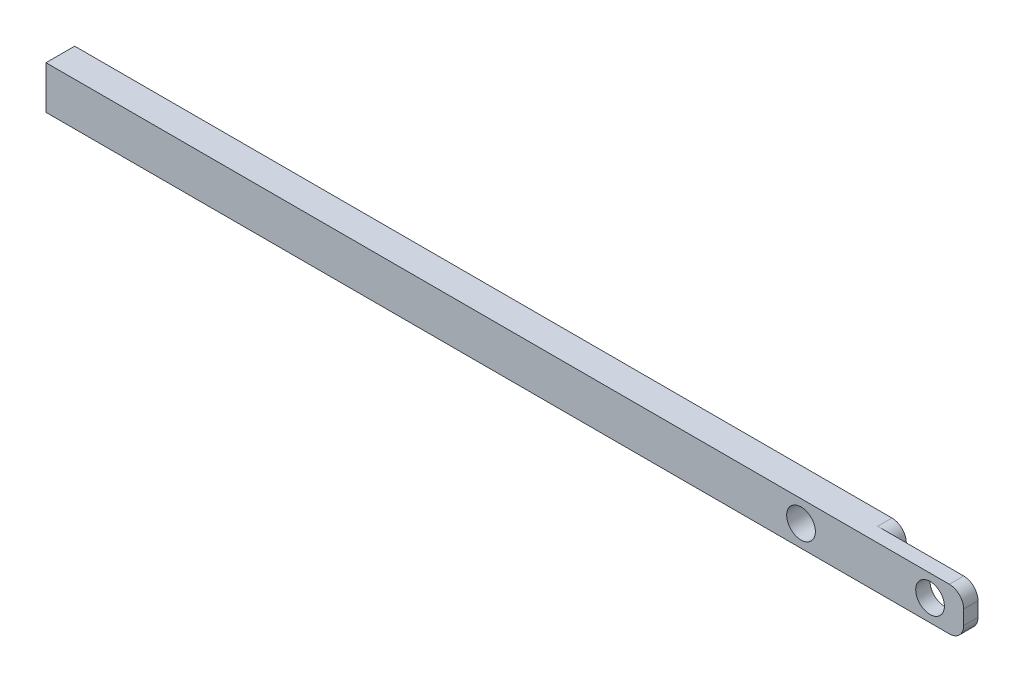
ISO-10303-21;
HEADER;
FILE_DESCRIPTION(('STEP AP214'),'2;1');
FILE_NAME('part.step','',(''),(''),'','','');
FILE_SCHEMA(('AUTOMOTIVE_DESIGN { 1 0 10303 214 1 1 1 1 }'));
ENDSEC;
DATA;
#1=APPLICATION_CONTEXT('core data for automotive mechanical design processes');
#2=APPLICATION_PROTOCOL_DEFINITION('international standard','automotive_design',2000,#1);
#3=PRODUCT_CONTEXT('',#1,'mechanical');
#4=PRODUCT('Part','Part','',(#3));
#5=PRODUCT_RELATED_PRODUCT_CATEGORY('part','',(#4));
#6=PRODUCT_DEFINITION_FORMATION('','',#4);
#7=PRODUCT_DEFINITION_CONTEXT('part definition',#1,'design');
#8=PRODUCT_DEFINITION('design','',#6,#7);
#9=PRODUCT_DEFINITION_SHAPE('','',#8);
#10=(LENGTH_UNIT() NAMED_UNIT(*) SI_UNIT(.MILLI.,.METRE.));
#11=(NAMED_UNIT(*) PLANE_ANGLE_UNIT() SI_UNIT($,.RADIAN.));
#12=(NAMED_UNIT(*) SI_UNIT($,.STERADIAN.) SOLID_ANGLE_UNIT());
#13=UNCERTAINTY_MEASURE_WITH_UNIT(LENGTH_MEASURE(1.E-05),#10,'distance_accuracy_value','');
#14=(GEOMETRIC_REPRESENTATION_CONTEXT(3) GLOBAL_UNCERTAINTY_ASSIGNED_CONTEXT((#13)) GLOBAL_UNIT_ASSIGNED_CONTEXT((#10,
#11,#12)) REPRESENTATION_CONTEXT('',''));
#15=CARTESIAN_POINT('',(0.,0.,0.));
#16=DIRECTION('',(0.,0.,1.));
#17=DIRECTION('',(1.,0.,0.));
#18=AXIS2_PLACEMENT_3D('',#15,#16,#17);
#19=CARTESIAN_POINT('',(-637.611940298508,30.,-61.7910447761194));
#20=DIRECTION('',(1.,0.,0.));
#21=DIRECTION('',(0.,0.,-1.));
#22=AXIS2_PLACEMENT_3D('',#19,#20,#21);
#23=PLANE('',#22);
#24=DIRECTION('',(0.,0.,1.));
#25=VECTOR('',#24,1.);
#26=CARTESIAN_POINT('',(-637.611940298508,0.,-61.7910447761194));
#27=LINE('',#26,#25);
#28=CARTESIAN_POINT('',(-637.611940298508,0.,-61.7910447761194));
#29=VERTEX_POINT('',#28);
#30=CARTESIAN_POINT('',(-637.611940298508,0.,-41.7910447761194));
#31=VERTEX_POINT('',#30);
#32=EDGE_CURVE('E141',#29,#31,#27,.T.);
#33=ORIENTED_EDGE('',*,*,#32,.T.);
#34=DIRECTION('',(0.,-1.,0.));
#35=VECTOR('',#34,1.);
#36=CARTESIAN_POINT('',(-637.611940298508,30.,-41.7910447761194));
#37=LINE('',#36,#35);
#38=CARTESIAN_POINT('',(-637.611940298508,30.,-41.7910447761194));
#39=VERTEX_POINT('',#38);
#40=EDGE_CURVE('E120',#39,#31,#37,.T.);
#41=ORIENTED_EDGE('',*,*,#40,.F.);
#42=DIRECTION('',(0.,0.,1.));
#43=VECTOR('',#42,1.);
#44=CARTESIAN_POINT('',(-637.611940298508,30.,-61.7910447761194));
#45=LINE('',#44,#43);
#46=CARTESIAN_POINT('',(-637.611940298508,30.,-61.7910447761194));
#47=VERTEX_POINT('',#46);
#48=EDGE_CURVE('E128',#47,#39,#45,.T.);
#49=ORIENTED_EDGE('',*,*,#48,.F.);
#50=DIRECTION('',(0.,-1.,0.));
#51=VECTOR('',#50,1.);
#52=CARTESIAN_POINT('',(-637.611940298508,30.,-61.7910447761194));
#53=LINE('',#52,#51);
#54=EDGE_CURVE('E207',#47,#29,#53,.T.);
#55=ORIENTED_EDGE('',*,*,#54,.T.);
#56=EDGE_LOOP('',(#33,#41,#49,#55));
#57=FACE_BOUND('',#56,.T.);
#58=ADVANCED_FACE('F37',(#57),#23,.F.);
#59=CARTESIAN_POINT('',(-17.6119402985075,30.,-41.7910447761194));
#60=DIRECTION('',(0.,0.,-1.));
#61=DIRECTION('',(-1.,0.,0.));
#62=AXIS2_PLACEMENT_3D('',#59,#60,#61);
#63=PLANE('',#62);
#64=CARTESIAN_POINT('',(-21.0463603591865,15.,-41.7910447761194));
#65=DIRECTION('',(0.,0.,1.));
#66=DIRECTION('',(1.,0.,0.));
#67=AXIS2_PLACEMENT_3D('',#64,#65,#66);
#68=CIRCLE('',#67,10.);
#69=CARTESIAN_POINT('',(-11.0463603591865,15.,-41.7910447761194));
#70=VERTEX_POINT('',#69);
#71=EDGE_CURVE('E367',#70,#70,#68,.T.);
#72=ORIENTED_EDGE('',*,*,#71,.F.);
#73=EDGE_LOOP('',(#72));
#74=FACE_BOUND('',#73,.T.);
#75=CARTESIAN_POINT('',(-111.046360359186,15.,-41.7910447761194));
#76=DIRECTION('',(0.,0.,1.));
#77=DIRECTION('',(1.,0.,0.));
#78=AXIS2_PLACEMENT_3D('',#75,#76,#77);
#79=CIRCLE('',#78,10.);
#80=CARTESIAN_POINT('',(-101.046360359186,15.,-41.7910447761194));
#81=VERTEX_POINT('',#80);
#82=EDGE_CURVE('E370',#81,#81,#79,.T.);
#83=ORIENTED_EDGE('',*,*,#82,.F.);
#84=EDGE_LOOP('',(#83));
#85=FACE_BOUND('',#84,.T.);
#86=DIRECTION('',(1.,0.,0.));
#87=VECTOR('',#86,1.);
#88=CARTESIAN_POINT('',(-17.6119402985075,0.,-41.7910447761194));
#89=LINE('',#88,#87);
#90=CARTESIAN_POINT('',(-7.61194029850754,0.,-41.7910447761194));
#91=VERTEX_POINT('',#90);
#92=EDGE_CURVE('E203',#31,#91,#89,.T.);
#93=ORIENTED_EDGE('',*,*,#92,.T.);
#94=CARTESIAN_POINT('',(-7.61194029850754,10.,-41.7910447761194));
#95=DIRECTION('',(0.,0.,-1.));
#96=DIRECTION('',(-1.,0.,0.));
#97=AXIS2_PLACEMENT_3D('',#94,#95,#96);
#98=CIRCLE('',#97,10.);
#99=CARTESIAN_POINT('',(2.38805970149246,10.,-41.7910447761194));
#100=VERTEX_POINT('',#99);
#101=EDGE_CURVE('E53',#91,#100,#98,.F.);
#102=ORIENTED_EDGE('',*,*,#101,.T.);
#103=DIRECTION('',(0.,-1.,0.));
#104=VECTOR('',#103,1.);
#105=CARTESIAN_POINT('',(2.38805970149246,30.,-41.7910447761194));
#106=LINE('',#105,#104);
#107=CARTESIAN_POINT('',(2.38805970149246,20.,-41.7910447761194));
#108=VERTEX_POINT('',#107);
#109=EDGE_CURVE('E143',#108,#100,#106,.T.);
#110=ORIENTED_EDGE('',*,*,#109,.F.);
#111=CARTESIAN_POINT('',(-7.61194029850754,20.,-41.7910447761194));
#112=DIRECTION('',(0.,0.,-1.));
#113=DIRECTION('',(-1.,0.,0.));
#114=AXIS2_PLACEMENT_3D('',#111,#112,#113);
#115=CIRCLE('',#114,10.);
#116=CARTESIAN_POINT('',(-7.61194029850754,30.,-41.7910447761194));
#117=VERTEX_POINT('',#116);
#118=EDGE_CURVE('E123',#108,#117,#115,.F.);
#119=ORIENTED_EDGE('',*,*,#118,.T.);
#120=DIRECTION('',(1.,0.,0.));
#121=VECTOR('',#120,1.);
#122=CARTESIAN_POINT('',(-637.611940298508,30.,-41.7910447761194));
#123=LINE('',#122,#121);
#124=EDGE_CURVE('E116',#39,#117,#123,.T.);
#125=ORIENTED_EDGE('',*,*,#124,.F.);
#126=ORIENTED_EDGE('',*,*,#40,.T.);
#127=EDGE_LOOP('',(#93,#102,#110,#119,#125,#126));
#128=FACE_BOUND('',#127,.T.);
#129=ADVANCED_FACE('F118',(#74,#85,#128),#63,.F.);
#130=CARTESIAN_POINT('',(2.38805970149246,30.,-41.7910447761194));
#131=DIRECTION('',(-1.,0.,0.));
#132=DIRECTION('',(0.,0.,1.));
#133=AXIS2_PLACEMENT_3D('',#130,#131,#132);
#134=PLANE('',#133);
#135=ORIENTED_EDGE('',*,*,#109,.T.);
#136=DIRECTION('',(0.,0.,-1.));
#137=VECTOR('',#136,1.);
#138=CARTESIAN_POINT('',(2.38805970149246,10.,-41.7910447761194));
#139=LINE('',#138,#137);
#140=CARTESIAN_POINT('',(2.38805970149246,10.,-51.7910447761194));
#141=VERTEX_POINT('',#140);
#142=EDGE_CURVE('E167',#100,#141,#139,.T.);
#143=ORIENTED_EDGE('',*,*,#142,.T.);
#144=DIRECTION('',(0.,-1.,0.));
#145=VECTOR('',#144,1.);
#146=CARTESIAN_POINT('',(2.38805970149246,30.,-51.7910447761194));
#147=LINE('',#146,#145);
#148=CARTESIAN_POINT('',(2.38805970149246,20.,-51.7910447761194));
#149=VERTEX_POINT('',#148);
#150=EDGE_CURVE('E147',#149,#141,#147,.T.);
#151=ORIENTED_EDGE('',*,*,#150,.F.);
#152=DIRECTION('',(0.,0.,-1.));
#153=VECTOR('',#152,1.);
#154=CARTESIAN_POINT('',(2.38805970149246,20.,-41.7910447761194));
#155=LINE('',#154,#153);
#156=EDGE_CURVE('E60',#149,#108,#155,.F.);
#157=ORIENTED_EDGE('',*,*,#156,.T.);
#158=EDGE_LOOP('',(#135,#143,#151,#157));
#159=FACE_BOUND('',#158,.T.);
#160=ADVANCED_FACE('F210',(#159),#134,.F.);
#161=CARTESIAN_POINT('',(-57.6119402985076,30.,-51.7910447761194));
#162=DIRECTION('',(0.,0.,1.));
#163=DIRECTION('',(1.,0.,0.));
#164=AXIS2_PLACEMENT_3D('',#161,#162,#163);
#165=PLANE('',#164);
#166=CARTESIAN_POINT('',(-21.0463603591865,15.,-51.7910447761194));
#167=DIRECTION('',(0.,0.,1.));
#168=DIRECTION('',(1.,0.,0.));
#169=AXIS2_PLACEMENT_3D('',#166,#167,#168);
#170=CIRCLE('',#169,10.);
#171=CARTESIAN_POINT('',(-11.0463603591865,15.,-51.7910447761194));
#172=VERTEX_POINT('',#171);
#173=EDGE_CURVE('E41',#172,#172,#170,.T.);
#174=ORIENTED_EDGE('',*,*,#173,.T.);
#175=EDGE_LOOP('',(#174));
#176=FACE_BOUND('',#175,.T.);
#177=ORIENTED_EDGE('',*,*,#150,.T.);
#178=CARTESIAN_POINT('',(-7.61194029850754,10.,-51.7910447761194));
#179=DIRECTION('',(0.,0.,1.));
#180=DIRECTION('',(1.,0.,0.));
#181=AXIS2_PLACEMENT_3D('',#178,#179,#180);
#182=CIRCLE('',#181,10.);
#183=CARTESIAN_POINT('',(-7.61194029850754,0.,-51.7910447761194));
#184=VERTEX_POINT('',#183);
#185=EDGE_CURVE('E172',#141,#184,#182,.F.);
#186=ORIENTED_EDGE('',*,*,#185,.T.);
#187=DIRECTION('',(-1.,0.,0.));
#188=VECTOR('',#187,1.);
#189=CARTESIAN_POINT('',(-57.6119402985076,0.,-51.7910447761194));
#190=LINE('',#189,#188);
#191=CARTESIAN_POINT('',(-67.6119402985076,0.,-51.7910447761194));
#192=VERTEX_POINT('',#191);
#193=EDGE_CURVE('E185',#184,#192,#190,.T.);
#194=ORIENTED_EDGE('',*,*,#193,.T.);
#195=CARTESIAN_POINT('',(-67.6119402985076,10.,-51.7910447761194));
#196=DIRECTION('',(0.,0.,1.));
#197=DIRECTION('',(1.,0.,0.));
#198=AXIS2_PLACEMENT_3D('',#195,#196,#197);
#199=CIRCLE('',#198,10.);
#200=CARTESIAN_POINT('',(-57.6119402985076,10.,-51.7910447761194));
#201=VERTEX_POINT('',#200);
#202=EDGE_CURVE('E46',#192,#201,#199,.T.);
#203=ORIENTED_EDGE('',*,*,#202,.T.);
#204=DIRECTION('',(0.,-1.,0.));
#205=VECTOR('',#204,1.);
#206=CARTESIAN_POINT('',(-57.6119402985076,30.,-51.7910447761194));
#207=LINE('',#206,#205);
#208=CARTESIAN_POINT('',(-57.6119402985076,20.,-51.7910447761194));
#209=VERTEX_POINT('',#208);
#210=EDGE_CURVE('E182',#209,#201,#207,.T.);
#211=ORIENTED_EDGE('',*,*,#210,.F.);
#212=CARTESIAN_POINT('',(-67.6119402985076,20.,-51.7910447761194));
#213=DIRECTION('',(0.,0.,1.));
#214=DIRECTION('',(1.,0.,0.));
#215=AXIS2_PLACEMENT_3D('',#212,#213,#214);
#216=CIRCLE('',#215,10.);
#217=CARTESIAN_POINT('',(-67.6119402985076,30.,-51.7910447761194));
#218=VERTEX_POINT('',#217);
#219=EDGE_CURVE('E11',#209,#218,#216,.T.);
#220=ORIENTED_EDGE('',*,*,#219,.T.);
#221=DIRECTION('',(-1.,0.,0.));
#222=VECTOR('',#221,1.);
#223=CARTESIAN_POINT('',(-57.6119402985076,30.,-51.7910447761194));
#224=LINE('',#223,#222);
#225=CARTESIAN_POINT('',(-7.61194029850754,30.,-51.7910447761194));
#226=VERTEX_POINT('',#225);
#227=EDGE_CURVE('E127',#226,#218,#224,.T.);
#228=ORIENTED_EDGE('',*,*,#227,.F.);
#229=CARTESIAN_POINT('',(-7.61194029850754,20.,-51.7910447761194));
#230=DIRECTION('',(0.,0.,1.));
#231=DIRECTION('',(1.,0.,0.));
#232=AXIS2_PLACEMENT_3D('',#229,#230,#231);
#233=CIRCLE('',#232,10.);
#234=EDGE_CURVE('E170',#226,#149,#233,.F.);
#235=ORIENTED_EDGE('',*,*,#234,.T.);
#236=EDGE_LOOP('',(#177,#186,#194,#203,#211,#220,#228,#235));
#237=FACE_BOUND('',#236,.T.);
#238=ADVANCED_FACE('F181',(#176,#237),#165,.F.);
#239=CARTESIAN_POINT('',(-57.6119402985076,30.,-61.7910447761194));
#240=DIRECTION('',(-1.,0.,0.));
#241=DIRECTION('',(0.,0.,1.));
#242=AXIS2_PLACEMENT_3D('',#239,#240,#241);
#243=PLANE('',#242);
#244=ORIENTED_EDGE('',*,*,#210,.T.);
#245=DIRECTION('',(0.,0.,-1.));
#246=VECTOR('',#245,1.);
#247=CARTESIAN_POINT('',(-57.6119402985076,10.,-61.7910447761194));
#248=LINE('',#247,#246);
#249=CARTESIAN_POINT('',(-57.6119402985076,10.,-61.7910447761194));
#250=VERTEX_POINT('',#249);
#251=EDGE_CURVE('E145',#201,#250,#248,.T.);
#252=ORIENTED_EDGE('',*,*,#251,.T.);
#253=DIRECTION('',(0.,-1.,0.));
#254=VECTOR('',#253,1.);
#255=CARTESIAN_POINT('',(-57.6119402985076,30.,-61.7910447761194));
#256=LINE('',#255,#254);
#257=CARTESIAN_POINT('',(-57.6119402985076,20.,-61.7910447761194));
#258=VERTEX_POINT('',#257);
#259=EDGE_CURVE('E194',#258,#250,#256,.T.);
#260=ORIENTED_EDGE('',*,*,#259,.F.);
#261=DIRECTION('',(0.,0.,-1.));
#262=VECTOR('',#261,1.);
#263=CARTESIAN_POINT('',(-57.6119402985076,20.,-51.7910447761194));
#264=LINE('',#263,#262);
#265=EDGE_CURVE('E142',#258,#209,#264,.F.);
#266=ORIENTED_EDGE('',*,*,#265,.T.);
#267=EDGE_LOOP('',(#244,#252,#260,#266));
#268=FACE_BOUND('',#267,.T.);
#269=ADVANCED_FACE('F190',(#268),#243,.F.);
#270=CARTESIAN_POINT('',(-637.611940298508,30.,-61.7910447761194));
#271=DIRECTION('',(0.,0.,1.));
#272=DIRECTION('',(1.,0.,0.));
#273=AXIS2_PLACEMENT_3D('',#270,#271,#272);
#274=PLANE('',#273);
#275=CARTESIAN_POINT('',(-111.046360359186,15.,-61.7910447761194));
#276=DIRECTION('',(0.,0.,1.));
#277=DIRECTION('',(1.,0.,0.));
#278=AXIS2_PLACEMENT_3D('',#275,#276,#277);
#279=CIRCLE('',#278,10.);
#280=CARTESIAN_POINT('',(-101.046360359186,15.,-61.7910447761194));
#281=VERTEX_POINT('',#280);
#282=EDGE_CURVE('E373',#281,#281,#279,.T.);
#283=ORIENTED_EDGE('',*,*,#282,.T.);
#284=EDGE_LOOP('',(#283));
#285=FACE_BOUND('',#284,.T.);
#286=ORIENTED_EDGE('',*,*,#259,.T.);
#287=CARTESIAN_POINT('',(-67.6119402985076,10.,-61.7910447761194));
#288=DIRECTION('',(0.,0.,1.));
#289=DIRECTION('',(1.,0.,0.));
#290=AXIS2_PLACEMENT_3D('',#287,#288,#289);
#291=CIRCLE('',#290,10.);
#292=CARTESIAN_POINT('',(-67.6119402985076,0.,-61.7910447761194));
#293=VERTEX_POINT('',#292);
#294=EDGE_CURVE('E155',#250,#293,#291,.F.);
#295=ORIENTED_EDGE('',*,*,#294,.T.);
#296=DIRECTION('',(-1.,0.,0.));
#297=VECTOR('',#296,1.);
#298=CARTESIAN_POINT('',(-637.611940298508,0.,-61.7910447761194));
#299=LINE('',#298,#297);
#300=EDGE_CURVE('E138',#293,#29,#299,.T.);
#301=ORIENTED_EDGE('',*,*,#300,.T.);
#302=ORIENTED_EDGE('',*,*,#54,.F.);
#303=DIRECTION('',(-1.,0.,0.));
#304=VECTOR('',#303,1.);
#305=CARTESIAN_POINT('',(-637.611940298508,30.,-61.7910447761194));
#306=LINE('',#305,#304);
#307=CARTESIAN_POINT('',(-67.6119402985076,30.,-61.7910447761194));
#308=VERTEX_POINT('',#307);
#309=EDGE_CURVE('E134',#308,#47,#306,.T.);
#310=ORIENTED_EDGE('',*,*,#309,.F.);
#311=CARTESIAN_POINT('',(-67.6119402985076,20.,-61.7910447761194));
#312=DIRECTION('',(0.,0.,1.));
#313=DIRECTION('',(1.,0.,0.));
#314=AXIS2_PLACEMENT_3D('',#311,#312,#313);
#315=CIRCLE('',#314,10.);
#316=EDGE_CURVE('E153',#308,#258,#315,.F.);
#317=ORIENTED_EDGE('',*,*,#316,.T.);
#318=EDGE_LOOP('',(#286,#295,#301,#302,#310,#317));
#319=FACE_BOUND('',#318,.T.);
#320=ADVANCED_FACE('F199',(#285,#319),#274,.F.);
#321=CARTESIAN_POINT('',(0.,30.,0.));
#322=DIRECTION('',(0.,1.,0.));
#323=DIRECTION('',(0.,0.,1.));
#324=AXIS2_PLACEMENT_3D('',#321,#322,#323);
#325=PLANE('',#324);
#326=ORIENTED_EDGE('',*,*,#227,.T.);
#327=DIRECTION('',(0.,0.,-1.));
#328=VECTOR('',#327,1.);
#329=CARTESIAN_POINT('',(-67.6119402985076,30.,-61.7910447761194));
#330=LINE('',#329,#328);
#331=EDGE_CURVE('E164',#218,#308,#330,.T.);
#332=ORIENTED_EDGE('',*,*,#331,.T.);
#333=ORIENTED_EDGE('',*,*,#309,.T.);
#334=ORIENTED_EDGE('',*,*,#48,.T.);
#335=ORIENTED_EDGE('',*,*,#124,.T.);
#336=DIRECTION('',(0.,0.,-1.));
#337=VECTOR('',#336,1.);
#338=CARTESIAN_POINT('',(-7.61194029850754,30.,-51.7910447761194));
#339=LINE('',#338,#337);
#340=EDGE_CURVE('E162',#117,#226,#339,.T.);
#341=ORIENTED_EDGE('',*,*,#340,.T.);
#342=EDGE_LOOP('',(#326,#332,#333,#334,#335,#341));
#343=FACE_BOUND('',#342,.T.);
#344=ADVANCED_FACE('F131',(#343),#325,.T.);
#345=CARTESIAN_POINT('',(0.,0.,0.));
#346=DIRECTION('',(0.,1.,0.));
#347=DIRECTION('',(0.,0.,1.));
#348=AXIS2_PLACEMENT_3D('',#345,#346,#347);
#349=PLANE('',#348);
#350=ORIENTED_EDGE('',*,*,#300,.F.);
#351=DIRECTION('',(0.,0.,-1.));
#352=VECTOR('',#351,1.);
#353=CARTESIAN_POINT('',(-67.6119402985076,0.,0.));
#354=LINE('',#353,#352);
#355=EDGE_CURVE('E159',#293,#192,#354,.F.);
#356=ORIENTED_EDGE('',*,*,#355,.T.);
#357=ORIENTED_EDGE('',*,*,#193,.F.);
#358=DIRECTION('',(0.,0.,-1.));
#359=VECTOR('',#358,1.);
#360=CARTESIAN_POINT('',(-7.61194029850754,0.,0.));
#361=LINE('',#360,#359);
#362=EDGE_CURVE('E157',#184,#91,#361,.F.);
#363=ORIENTED_EDGE('',*,*,#362,.T.);
#364=ORIENTED_EDGE('',*,*,#92,.F.);
#365=ORIENTED_EDGE('',*,*,#32,.F.);
#366=EDGE_LOOP('',(#350,#356,#357,#363,#364,#365));
#367=FACE_BOUND('',#366,.T.);
#368=ADVANCED_FACE('F201',(#367),#349,.F.);
#369=CARTESIAN_POINT('',(-67.6119402985076,10.,-61.7910447761194));
#370=DIRECTION('',(0.,0.,-1.));
#371=DIRECTION('',(-1.,0.,0.));
#372=AXIS2_PLACEMENT_3D('',#369,#370,#371);
#373=CYLINDRICAL_SURFACE('',#372,10.);
#374=ORIENTED_EDGE('',*,*,#202,.F.);
#375=ORIENTED_EDGE('',*,*,#355,.F.);
#376=ORIENTED_EDGE('',*,*,#294,.F.);
#377=ORIENTED_EDGE('',*,*,#251,.F.);
#378=EDGE_LOOP('',(#374,#375,#376,#377));
#379=FACE_BOUND('',#378,.T.);
#380=ADVANCED_FACE('F196',(#379),#373,.T.);
#381=CARTESIAN_POINT('',(-67.6119402985076,20.,0.));
#382=DIRECTION('',(0.,0.,1.));
#383=DIRECTION('',(1.,0.,0.));
#384=AXIS2_PLACEMENT_3D('',#381,#382,#383);
#385=CYLINDRICAL_SURFACE('',#384,10.);
#386=ORIENTED_EDGE('',*,*,#219,.F.);
#387=ORIENTED_EDGE('',*,*,#265,.F.);
#388=ORIENTED_EDGE('',*,*,#316,.F.);
#389=ORIENTED_EDGE('',*,*,#331,.F.);
#390=EDGE_LOOP('',(#386,#387,#388,#389));
#391=FACE_BOUND('',#390,.T.);
#392=ADVANCED_FACE('F221',(#391),#385,.T.);
#393=CARTESIAN_POINT('',(-7.61194029850754,10.,-41.7910447761194));
#394=DIRECTION('',(0.,0.,-1.));
#395=DIRECTION('',(-1.,0.,0.));
#396=AXIS2_PLACEMENT_3D('',#393,#394,#395);
#397=CYLINDRICAL_SURFACE('',#396,10.);
#398=ORIENTED_EDGE('',*,*,#101,.F.);
#399=ORIENTED_EDGE('',*,*,#362,.F.);
#400=ORIENTED_EDGE('',*,*,#185,.F.);
#401=ORIENTED_EDGE('',*,*,#142,.F.);
#402=EDGE_LOOP('',(#398,#399,#400,#401));
#403=FACE_BOUND('',#402,.T.);
#404=ADVANCED_FACE('F219',(#403),#397,.T.);
#405=CARTESIAN_POINT('',(-7.61194029850754,20.,0.));
#406=DIRECTION('',(0.,0.,1.));
#407=DIRECTION('',(1.,0.,0.));
#408=AXIS2_PLACEMENT_3D('',#405,#406,#407);
#409=CYLINDRICAL_SURFACE('',#408,10.);
#410=ORIENTED_EDGE('',*,*,#118,.F.);
#411=ORIENTED_EDGE('',*,*,#156,.F.);
#412=ORIENTED_EDGE('',*,*,#234,.F.);
#413=ORIENTED_EDGE('',*,*,#340,.F.);
#414=EDGE_LOOP('',(#410,#411,#412,#413));
#415=FACE_BOUND('',#414,.T.);
#416=ADVANCED_FACE('F39',(#415),#409,.T.);
#417=CARTESIAN_POINT('',(-111.046360359186,15.,-61.7910447761194));
#418=DIRECTION('',(0.,0.,1.));
#419=DIRECTION('',(1.,0.,0.));
#420=AXIS2_PLACEMENT_3D('',#417,#418,#419);
#421=CYLINDRICAL_SURFACE('',#420,10.);
#422=ORIENTED_EDGE('',*,*,#282,.F.);
#423=EDGE_LOOP('',(#422));
#424=FACE_BOUND('',#423,.T.);
#425=ORIENTED_EDGE('',*,*,#82,.T.);
#426=EDGE_LOOP('',(#425));
#427=FACE_BOUND('',#426,.T.);
#428=ADVANCED_FACE('F226',(#424,#427),#421,.F.);
#429=CARTESIAN_POINT('',(-21.0463603591865,15.,-61.7910447761194));
#430=DIRECTION('',(0.,0.,1.));
#431=DIRECTION('',(1.,0.,0.));
#432=AXIS2_PLACEMENT_3D('',#429,#430,#431);
#433=CYLINDRICAL_SURFACE('',#432,10.);
#434=ORIENTED_EDGE('',*,*,#71,.T.);
#435=EDGE_LOOP('',(#434));
#436=FACE_BOUND('',#435,.T.);
#437=ORIENTED_EDGE('',*,*,#173,.F.);
#438=EDGE_LOOP('',(#437));
#439=FACE_BOUND('',#438,.T.);
#440=ADVANCED_FACE('F348',(#436,#439),#433,.F.);
#441=CLOSED_SHELL('',(#58,#129,#160,#238,#269,#320,#344,#368,#380,#392,#404,#416,#428,#440));
#442=MANIFOLD_SOLID_BREP('B2',#441);
#443=ADVANCED_BREP_SHAPE_REPRESENTATION('',(#18,#442),#14);
#444=SHAPE_DEFINITION_REPRESENTATION(#9,#443);
ENDSEC;
END-ISO-10303-21;
